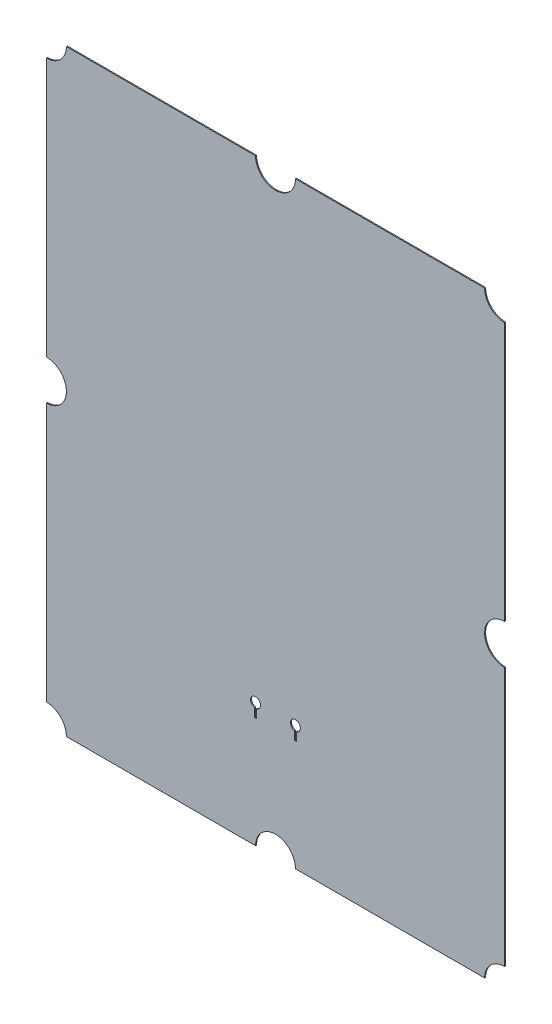
ISO-10303-21;
HEADER;
FILE_DESCRIPTION(('STEP AP214'),'2;1');
FILE_NAME('part.step','',(''),(''),'','','');
FILE_SCHEMA(('AUTOMOTIVE_DESIGN { 1 0 10303 214 1 1 1 1 }'));
ENDSEC;
DATA;
#1=APPLICATION_CONTEXT('core data for automotive mechanical design processes');
#2=APPLICATION_PROTOCOL_DEFINITION('international standard','automotive_design',2000,#1);
#3=PRODUCT_CONTEXT('',#1,'mechanical');
#4=PRODUCT('Part','Part','',(#3));
#5=PRODUCT_RELATED_PRODUCT_CATEGORY('part','',(#4));
#6=PRODUCT_DEFINITION_FORMATION('','',#4);
#7=PRODUCT_DEFINITION_CONTEXT('part definition',#1,'design');
#8=PRODUCT_DEFINITION('design','',#6,#7);
#9=PRODUCT_DEFINITION_SHAPE('','',#8);
#10=(LENGTH_UNIT() NAMED_UNIT(*) SI_UNIT(.MILLI.,.METRE.));
#11=(NAMED_UNIT(*) PLANE_ANGLE_UNIT() SI_UNIT($,.RADIAN.));
#12=(NAMED_UNIT(*) SI_UNIT($,.STERADIAN.) SOLID_ANGLE_UNIT());
#13=UNCERTAINTY_MEASURE_WITH_UNIT(LENGTH_MEASURE(1.E-05),#10,'distance_accuracy_value','');
#14=(GEOMETRIC_REPRESENTATION_CONTEXT(3) GLOBAL_UNCERTAINTY_ASSIGNED_CONTEXT((#13)) GLOBAL_UNIT_ASSIGNED_CONTEXT((#10,
#11,#12)) REPRESENTATION_CONTEXT('',''));
#15=CARTESIAN_POINT('',(0.,0.,0.));
#16=DIRECTION('',(0.,0.,1.));
#17=DIRECTION('',(1.,0.,0.));
#18=AXIS2_PLACEMENT_3D('',#15,#16,#17);
#19=CARTESIAN_POINT('',(-115.,150.,0.5));
#20=DIRECTION('',(0.,0.,-1.));
#21=DIRECTION('',(-1.,0.,0.));
#22=AXIS2_PLACEMENT_3D('',#19,#20,#21);
#23=CYLINDRICAL_SURFACE('',#22,9.99999999999999);
#24=CARTESIAN_POINT('',(-115.,150.,0.));
#25=DIRECTION('',(0.,0.,1.));
#26=DIRECTION('',(1.,0.,0.));
#27=AXIS2_PLACEMENT_3D('',#24,#25,#26);
#28=CIRCLE('',#27,9.99999999999999);
#29=CARTESIAN_POINT('',(-115.,140.,0.));
#30=VERTEX_POINT('',#29);
#31=CARTESIAN_POINT('',(-105.,150.,0.));
#32=VERTEX_POINT('',#31);
#33=EDGE_CURVE('E255',#30,#32,#28,.T.);
#34=ORIENTED_EDGE('',*,*,#33,.F.);
#35=DIRECTION('',(0.,0.,-1.));
#36=VECTOR('',#35,1.);
#37=CARTESIAN_POINT('',(-115.,140.,0.5));
#38=LINE('',#37,#36);
#39=CARTESIAN_POINT('',(-115.,140.,0.5));
#40=VERTEX_POINT('',#39);
#41=EDGE_CURVE('E11',#40,#30,#38,.T.);
#42=ORIENTED_EDGE('',*,*,#41,.F.);
#43=CARTESIAN_POINT('',(-115.,150.,0.5));
#44=DIRECTION('',(0.,0.,1.));
#45=DIRECTION('',(1.,0.,0.));
#46=AXIS2_PLACEMENT_3D('',#43,#44,#45);
#47=CIRCLE('',#46,9.99999999999999);
#48=CARTESIAN_POINT('',(-105.,150.,0.5));
#49=VERTEX_POINT('',#48);
#50=EDGE_CURVE('E262',#40,#49,#47,.T.);
#51=ORIENTED_EDGE('',*,*,#50,.T.);
#52=DIRECTION('',(0.,0.,-1.));
#53=VECTOR('',#52,1.);
#54=CARTESIAN_POINT('',(-105.,150.,0.5));
#55=LINE('',#54,#53);
#56=EDGE_CURVE('E35',#49,#32,#55,.T.);
#57=ORIENTED_EDGE('',*,*,#56,.T.);
#58=EDGE_LOOP('',(#34,#42,#51,#57));
#59=FACE_BOUND('',#58,.T.);
#60=ADVANCED_FACE('F32',(#59),#23,.F.);
#61=CARTESIAN_POINT('',(-115.,10.,0.5));
#62=DIRECTION('',(-1.,0.,0.));
#63=DIRECTION('',(0.,0.,1.));
#64=AXIS2_PLACEMENT_3D('',#61,#62,#63);
#65=PLANE('',#64);
#66=DIRECTION('',(0.,1.,0.));
#67=VECTOR('',#66,1.);
#68=CARTESIAN_POINT('',(-115.,10.,0.));
#69=LINE('',#68,#67);
#70=CARTESIAN_POINT('',(-115.,10.,0.));
#71=VERTEX_POINT('',#70);
#72=EDGE_CURVE('E266',#71,#30,#69,.T.);
#73=ORIENTED_EDGE('',*,*,#72,.F.);
#74=DIRECTION('',(0.,0.,-1.));
#75=VECTOR('',#74,1.);
#76=CARTESIAN_POINT('',(-115.,10.,0.5));
#77=LINE('',#76,#75);
#78=CARTESIAN_POINT('',(-115.,10.,0.5));
#79=VERTEX_POINT('',#78);
#80=EDGE_CURVE('E40',#79,#71,#77,.T.);
#81=ORIENTED_EDGE('',*,*,#80,.F.);
#82=DIRECTION('',(0.,1.,0.));
#83=VECTOR('',#82,1.);
#84=CARTESIAN_POINT('',(-115.,10.,0.5));
#85=LINE('',#84,#83);
#86=EDGE_CURVE('E308',#79,#40,#85,.T.);
#87=ORIENTED_EDGE('',*,*,#86,.T.);
#88=ORIENTED_EDGE('',*,*,#41,.T.);
#89=EDGE_LOOP('',(#73,#81,#87,#88));
#90=FACE_BOUND('',#89,.T.);
#91=ADVANCED_FACE('F395',(#90),#65,.T.);
#92=CARTESIAN_POINT('',(-115.,0.,0.5));
#93=DIRECTION('',(0.,0.,-1.));
#94=DIRECTION('',(-1.,0.,0.));
#95=AXIS2_PLACEMENT_3D('',#92,#93,#94);
#96=CYLINDRICAL_SURFACE('',#95,10.);
#97=CARTESIAN_POINT('',(-115.,0.,0.));
#98=DIRECTION('',(0.,0.,1.));
#99=DIRECTION('',(1.,0.,0.));
#100=AXIS2_PLACEMENT_3D('',#97,#98,#99);
#101=CIRCLE('',#100,10.);
#102=CARTESIAN_POINT('',(-115.,-9.99999999999998,0.));
#103=VERTEX_POINT('',#102);
#104=EDGE_CURVE('E352',#103,#71,#101,.T.);
#105=ORIENTED_EDGE('',*,*,#104,.F.);
#106=DIRECTION('',(0.,0.,-1.));
#107=VECTOR('',#106,1.);
#108=CARTESIAN_POINT('',(-115.,-9.99999999999998,0.5));
#109=LINE('',#108,#107);
#110=CARTESIAN_POINT('',(-115.,-9.99999999999998,0.5));
#111=VERTEX_POINT('',#110);
#112=EDGE_CURVE('E358',#111,#103,#109,.T.);
#113=ORIENTED_EDGE('',*,*,#112,.F.);
#114=CARTESIAN_POINT('',(-115.,0.,0.5));
#115=DIRECTION('',(0.,0.,1.));
#116=DIRECTION('',(1.,0.,0.));
#117=AXIS2_PLACEMENT_3D('',#114,#115,#116);
#118=CIRCLE('',#117,10.);
#119=EDGE_CURVE('E305',#111,#79,#118,.T.);
#120=ORIENTED_EDGE('',*,*,#119,.T.);
#121=ORIENTED_EDGE('',*,*,#80,.T.);
#122=EDGE_LOOP('',(#105,#113,#120,#121));
#123=FACE_BOUND('',#122,.T.);
#124=ADVANCED_FACE('F447',(#123),#96,.F.);
#125=CARTESIAN_POINT('',(-115.,-140.,0.5));
#126=DIRECTION('',(-1.,0.,0.));
#127=DIRECTION('',(0.,0.,1.));
#128=AXIS2_PLACEMENT_3D('',#125,#126,#127);
#129=PLANE('',#128);
#130=DIRECTION('',(0.,1.,0.));
#131=VECTOR('',#130,1.);
#132=CARTESIAN_POINT('',(-115.,-140.,0.));
#133=LINE('',#132,#131);
#134=CARTESIAN_POINT('',(-115.,-140.,0.));
#135=VERTEX_POINT('',#134);
#136=EDGE_CURVE('E349',#135,#103,#133,.T.);
#137=ORIENTED_EDGE('',*,*,#136,.F.);
#138=DIRECTION('',(0.,0.,-1.));
#139=VECTOR('',#138,1.);
#140=CARTESIAN_POINT('',(-115.,-140.,0.5));
#141=LINE('',#140,#139);
#142=CARTESIAN_POINT('',(-115.,-140.,0.5));
#143=VERTEX_POINT('',#142);
#144=EDGE_CURVE('E360',#143,#135,#141,.T.);
#145=ORIENTED_EDGE('',*,*,#144,.F.);
#146=DIRECTION('',(0.,1.,0.));
#147=VECTOR('',#146,1.);
#148=CARTESIAN_POINT('',(-115.,-140.,0.5));
#149=LINE('',#148,#147);
#150=EDGE_CURVE('E302',#143,#111,#149,.T.);
#151=ORIENTED_EDGE('',*,*,#150,.T.);
#152=ORIENTED_EDGE('',*,*,#112,.T.);
#153=EDGE_LOOP('',(#137,#145,#151,#152));
#154=FACE_BOUND('',#153,.T.);
#155=ADVANCED_FACE('F445',(#154),#129,.T.);
#156=CARTESIAN_POINT('',(-115.,-150.,0.5));
#157=DIRECTION('',(0.,0.,-1.));
#158=DIRECTION('',(-1.,0.,0.));
#159=AXIS2_PLACEMENT_3D('',#156,#157,#158);
#160=CYLINDRICAL_SURFACE('',#159,10.);
#161=CARTESIAN_POINT('',(-115.,-150.,0.));
#162=DIRECTION('',(0.,0.,1.));
#163=DIRECTION('',(1.,0.,0.));
#164=AXIS2_PLACEMENT_3D('',#161,#162,#163);
#165=CIRCLE('',#164,10.);
#166=CARTESIAN_POINT('',(-105.,-150.,0.));
#167=VERTEX_POINT('',#166);
#168=EDGE_CURVE('E346',#167,#135,#165,.T.);
#169=ORIENTED_EDGE('',*,*,#168,.F.);
#170=DIRECTION('',(0.,0.,-1.));
#171=VECTOR('',#170,1.);
#172=CARTESIAN_POINT('',(-105.,-150.,0.5));
#173=LINE('',#172,#171);
#174=CARTESIAN_POINT('',(-105.,-150.,0.5));
#175=VERTEX_POINT('',#174);
#176=EDGE_CURVE('E362',#175,#167,#173,.T.);
#177=ORIENTED_EDGE('',*,*,#176,.F.);
#178=CARTESIAN_POINT('',(-115.,-150.,0.5));
#179=DIRECTION('',(0.,0.,1.));
#180=DIRECTION('',(1.,0.,0.));
#181=AXIS2_PLACEMENT_3D('',#178,#179,#180);
#182=CIRCLE('',#181,10.);
#183=EDGE_CURVE('E299',#175,#143,#182,.T.);
#184=ORIENTED_EDGE('',*,*,#183,.T.);
#185=ORIENTED_EDGE('',*,*,#144,.T.);
#186=EDGE_LOOP('',(#169,#177,#184,#185));
#187=FACE_BOUND('',#186,.T.);
#188=ADVANCED_FACE('F441',(#187),#160,.F.);
#189=CARTESIAN_POINT('',(-9.99999999999993,-150.,0.5));
#190=DIRECTION('',(0.,-1.,0.));
#191=DIRECTION('',(0.,0.,-1.));
#192=AXIS2_PLACEMENT_3D('',#189,#190,#191);
#193=PLANE('',#192);
#194=DIRECTION('',(-1.,0.,0.));
#195=VECTOR('',#194,1.);
#196=CARTESIAN_POINT('',(-9.99999999999993,-150.,0.));
#197=LINE('',#196,#195);
#198=CARTESIAN_POINT('',(-9.99999999999993,-150.,0.));
#199=VERTEX_POINT('',#198);
#200=EDGE_CURVE('E343',#199,#167,#197,.T.);
#201=ORIENTED_EDGE('',*,*,#200,.F.);
#202=DIRECTION('',(0.,0.,-1.));
#203=VECTOR('',#202,1.);
#204=CARTESIAN_POINT('',(-9.99999999999993,-150.,0.5));
#205=LINE('',#204,#203);
#206=CARTESIAN_POINT('',(-9.99999999999993,-150.,0.5));
#207=VERTEX_POINT('',#206);
#208=EDGE_CURVE('E364',#207,#199,#205,.T.);
#209=ORIENTED_EDGE('',*,*,#208,.F.);
#210=DIRECTION('',(-1.,0.,0.));
#211=VECTOR('',#210,1.);
#212=CARTESIAN_POINT('',(-9.99999999999993,-150.,0.5));
#213=LINE('',#212,#211);
#214=EDGE_CURVE('E296',#207,#175,#213,.T.);
#215=ORIENTED_EDGE('',*,*,#214,.T.);
#216=ORIENTED_EDGE('',*,*,#176,.T.);
#217=EDGE_LOOP('',(#201,#209,#215,#216));
#218=FACE_BOUND('',#217,.T.);
#219=ADVANCED_FACE('F437',(#218),#193,.T.);
#220=CARTESIAN_POINT('',(0.,-150.,0.5));
#221=DIRECTION('',(0.,0.,-1.));
#222=DIRECTION('',(-1.,0.,0.));
#223=AXIS2_PLACEMENT_3D('',#220,#221,#222);
#224=CYLINDRICAL_SURFACE('',#223,9.99999999999996);
#225=CARTESIAN_POINT('',(0.,-150.,0.));
#226=DIRECTION('',(0.,0.,1.));
#227=DIRECTION('',(1.,0.,0.));
#228=AXIS2_PLACEMENT_3D('',#225,#226,#227);
#229=CIRCLE('',#228,9.99999999999996);
#230=CARTESIAN_POINT('',(10.,-150.,0.));
#231=VERTEX_POINT('',#230);
#232=EDGE_CURVE('E340',#231,#199,#229,.T.);
#233=ORIENTED_EDGE('',*,*,#232,.F.);
#234=DIRECTION('',(0.,0.,-1.));
#235=VECTOR('',#234,1.);
#236=CARTESIAN_POINT('',(10.,-150.,0.5));
#237=LINE('',#236,#235);
#238=CARTESIAN_POINT('',(10.,-150.,0.5));
#239=VERTEX_POINT('',#238);
#240=EDGE_CURVE('E366',#239,#231,#237,.T.);
#241=ORIENTED_EDGE('',*,*,#240,.F.);
#242=CARTESIAN_POINT('',(0.,-150.,0.5));
#243=DIRECTION('',(0.,0.,1.));
#244=DIRECTION('',(1.,0.,0.));
#245=AXIS2_PLACEMENT_3D('',#242,#243,#244);
#246=CIRCLE('',#245,9.99999999999996);
#247=EDGE_CURVE('E293',#239,#207,#246,.T.);
#248=ORIENTED_EDGE('',*,*,#247,.T.);
#249=ORIENTED_EDGE('',*,*,#208,.T.);
#250=EDGE_LOOP('',(#233,#241,#248,#249));
#251=FACE_BOUND('',#250,.T.);
#252=ADVANCED_FACE('F433',(#251),#224,.F.);
#253=CARTESIAN_POINT('',(105.,-150.,0.5));
#254=DIRECTION('',(0.,-1.,0.));
#255=DIRECTION('',(0.,0.,-1.));
#256=AXIS2_PLACEMENT_3D('',#253,#254,#255);
#257=PLANE('',#256);
#258=DIRECTION('',(-1.,0.,0.));
#259=VECTOR('',#258,1.);
#260=CARTESIAN_POINT('',(105.,-150.,0.));
#261=LINE('',#260,#259);
#262=CARTESIAN_POINT('',(105.,-150.,0.));
#263=VERTEX_POINT('',#262);
#264=EDGE_CURVE('E337',#263,#231,#261,.T.);
#265=ORIENTED_EDGE('',*,*,#264,.F.);
#266=DIRECTION('',(0.,0.,-1.));
#267=VECTOR('',#266,1.);
#268=CARTESIAN_POINT('',(105.,-150.,0.5));
#269=LINE('',#268,#267);
#270=CARTESIAN_POINT('',(105.,-150.,0.5));
#271=VERTEX_POINT('',#270);
#272=EDGE_CURVE('E368',#271,#263,#269,.T.);
#273=ORIENTED_EDGE('',*,*,#272,.F.);
#274=DIRECTION('',(-1.,0.,0.));
#275=VECTOR('',#274,1.);
#276=CARTESIAN_POINT('',(105.,-150.,0.5));
#277=LINE('',#276,#275);
#278=EDGE_CURVE('E290',#271,#239,#277,.T.);
#279=ORIENTED_EDGE('',*,*,#278,.T.);
#280=ORIENTED_EDGE('',*,*,#240,.T.);
#281=EDGE_LOOP('',(#265,#273,#279,#280));
#282=FACE_BOUND('',#281,.T.);
#283=ADVANCED_FACE('F429',(#282),#257,.T.);
#284=CARTESIAN_POINT('',(115.,-150.,0.5));
#285=DIRECTION('',(0.,0.,-1.));
#286=DIRECTION('',(-1.,0.,0.));
#287=AXIS2_PLACEMENT_3D('',#284,#285,#286);
#288=CYLINDRICAL_SURFACE('',#287,9.99999999999999);
#289=CARTESIAN_POINT('',(115.,-150.,0.));
#290=DIRECTION('',(0.,0.,1.));
#291=DIRECTION('',(1.,0.,0.));
#292=AXIS2_PLACEMENT_3D('',#289,#290,#291);
#293=CIRCLE('',#292,9.99999999999999);
#294=CARTESIAN_POINT('',(115.,-140.,0.));
#295=VERTEX_POINT('',#294);
#296=EDGE_CURVE('E334',#295,#263,#293,.T.);
#297=ORIENTED_EDGE('',*,*,#296,.F.);
#298=DIRECTION('',(0.,0.,-1.));
#299=VECTOR('',#298,1.);
#300=CARTESIAN_POINT('',(115.,-140.,0.5));
#301=LINE('',#300,#299);
#302=CARTESIAN_POINT('',(115.,-140.,0.5));
#303=VERTEX_POINT('',#302);
#304=EDGE_CURVE('E370',#303,#295,#301,.T.);
#305=ORIENTED_EDGE('',*,*,#304,.F.);
#306=CARTESIAN_POINT('',(115.,-150.,0.5));
#307=DIRECTION('',(0.,0.,1.));
#308=DIRECTION('',(1.,0.,0.));
#309=AXIS2_PLACEMENT_3D('',#306,#307,#308);
#310=CIRCLE('',#309,9.99999999999999);
#311=EDGE_CURVE('E287',#303,#271,#310,.T.);
#312=ORIENTED_EDGE('',*,*,#311,.T.);
#313=ORIENTED_EDGE('',*,*,#272,.T.);
#314=EDGE_LOOP('',(#297,#305,#312,#313));
#315=FACE_BOUND('',#314,.T.);
#316=ADVANCED_FACE('F425',(#315),#288,.F.);
#317=CARTESIAN_POINT('',(115.,-9.99999999999996,0.5));
#318=DIRECTION('',(1.,0.,0.));
#319=DIRECTION('',(0.,0.,-1.));
#320=AXIS2_PLACEMENT_3D('',#317,#318,#319);
#321=PLANE('',#320);
#322=DIRECTION('',(0.,-1.,0.));
#323=VECTOR('',#322,1.);
#324=CARTESIAN_POINT('',(115.,-9.99999999999996,0.));
#325=LINE('',#324,#323);
#326=CARTESIAN_POINT('',(115.,-9.99999999999996,0.));
#327=VERTEX_POINT('',#326);
#328=EDGE_CURVE('E331',#327,#295,#325,.T.);
#329=ORIENTED_EDGE('',*,*,#328,.F.);
#330=DIRECTION('',(0.,0.,-1.));
#331=VECTOR('',#330,1.);
#332=CARTESIAN_POINT('',(115.,-9.99999999999996,0.5));
#333=LINE('',#332,#331);
#334=CARTESIAN_POINT('',(115.,-9.99999999999996,0.5));
#335=VERTEX_POINT('',#334);
#336=EDGE_CURVE('E372',#335,#327,#333,.T.);
#337=ORIENTED_EDGE('',*,*,#336,.F.);
#338=DIRECTION('',(0.,-1.,0.));
#339=VECTOR('',#338,1.);
#340=CARTESIAN_POINT('',(115.,-9.99999999999996,0.5));
#341=LINE('',#340,#339);
#342=EDGE_CURVE('E284',#335,#303,#341,.T.);
#343=ORIENTED_EDGE('',*,*,#342,.T.);
#344=ORIENTED_EDGE('',*,*,#304,.T.);
#345=EDGE_LOOP('',(#329,#337,#343,#344));
#346=FACE_BOUND('',#345,.T.);
#347=ADVANCED_FACE('F421',(#346),#321,.T.);
#348=CARTESIAN_POINT('',(115.,0.,0.5));
#349=DIRECTION('',(0.,0.,-1.));
#350=DIRECTION('',(-1.,0.,0.));
#351=AXIS2_PLACEMENT_3D('',#348,#349,#350);
#352=CYLINDRICAL_SURFACE('',#351,9.99999999999998);
#353=CARTESIAN_POINT('',(115.,0.,0.));
#354=DIRECTION('',(0.,0.,1.));
#355=DIRECTION('',(1.,0.,0.));
#356=AXIS2_PLACEMENT_3D('',#353,#354,#355);
#357=CIRCLE('',#356,9.99999999999998);
#358=CARTESIAN_POINT('',(115.,9.99999999999999,0.));
#359=VERTEX_POINT('',#358);
#360=EDGE_CURVE('E328',#359,#327,#357,.T.);
#361=ORIENTED_EDGE('',*,*,#360,.F.);
#362=DIRECTION('',(0.,0.,-1.));
#363=VECTOR('',#362,1.);
#364=CARTESIAN_POINT('',(115.,9.99999999999999,0.5));
#365=LINE('',#364,#363);
#366=CARTESIAN_POINT('',(115.,9.99999999999999,0.5));
#367=VERTEX_POINT('',#366);
#368=EDGE_CURVE('E374',#367,#359,#365,.T.);
#369=ORIENTED_EDGE('',*,*,#368,.F.);
#370=CARTESIAN_POINT('',(115.,0.,0.5));
#371=DIRECTION('',(0.,0.,1.));
#372=DIRECTION('',(1.,0.,0.));
#373=AXIS2_PLACEMENT_3D('',#370,#371,#372);
#374=CIRCLE('',#373,9.99999999999998);
#375=EDGE_CURVE('E281',#367,#335,#374,.T.);
#376=ORIENTED_EDGE('',*,*,#375,.T.);
#377=ORIENTED_EDGE('',*,*,#336,.T.);
#378=EDGE_LOOP('',(#361,#369,#376,#377));
#379=FACE_BOUND('',#378,.T.);
#380=ADVANCED_FACE('F417',(#379),#352,.F.);
#381=CARTESIAN_POINT('',(115.,140.,0.5));
#382=DIRECTION('',(1.,0.,0.));
#383=DIRECTION('',(0.,0.,-1.));
#384=AXIS2_PLACEMENT_3D('',#381,#382,#383);
#385=PLANE('',#384);
#386=DIRECTION('',(0.,-1.,0.));
#387=VECTOR('',#386,1.);
#388=CARTESIAN_POINT('',(115.,140.,0.));
#389=LINE('',#388,#387);
#390=CARTESIAN_POINT('',(115.,140.,0.));
#391=VERTEX_POINT('',#390);
#392=EDGE_CURVE('E325',#391,#359,#389,.T.);
#393=ORIENTED_EDGE('',*,*,#392,.F.);
#394=DIRECTION('',(0.,0.,-1.));
#395=VECTOR('',#394,1.);
#396=CARTESIAN_POINT('',(115.,140.,0.5));
#397=LINE('',#396,#395);
#398=CARTESIAN_POINT('',(115.,140.,0.5));
#399=VERTEX_POINT('',#398);
#400=EDGE_CURVE('E376',#399,#391,#397,.T.);
#401=ORIENTED_EDGE('',*,*,#400,.F.);
#402=DIRECTION('',(0.,-1.,0.));
#403=VECTOR('',#402,1.);
#404=CARTESIAN_POINT('',(115.,140.,0.5));
#405=LINE('',#404,#403);
#406=EDGE_CURVE('E278',#399,#367,#405,.T.);
#407=ORIENTED_EDGE('',*,*,#406,.T.);
#408=ORIENTED_EDGE('',*,*,#368,.T.);
#409=EDGE_LOOP('',(#393,#401,#407,#408));
#410=FACE_BOUND('',#409,.T.);
#411=ADVANCED_FACE('F413',(#410),#385,.T.);
#412=CARTESIAN_POINT('',(115.,150.,0.5));
#413=DIRECTION('',(0.,0.,-1.));
#414=DIRECTION('',(-1.,0.,0.));
#415=AXIS2_PLACEMENT_3D('',#412,#413,#414);
#416=CYLINDRICAL_SURFACE('',#415,10.);
#417=CARTESIAN_POINT('',(115.,150.,0.));
#418=DIRECTION('',(0.,0.,1.));
#419=DIRECTION('',(1.,0.,0.));
#420=AXIS2_PLACEMENT_3D('',#417,#418,#419);
#421=CIRCLE('',#420,10.);
#422=CARTESIAN_POINT('',(105.,150.,0.));
#423=VERTEX_POINT('',#422);
#424=EDGE_CURVE('E322',#423,#391,#421,.T.);
#425=ORIENTED_EDGE('',*,*,#424,.F.);
#426=DIRECTION('',(0.,0.,-1.));
#427=VECTOR('',#426,1.);
#428=CARTESIAN_POINT('',(105.,150.,0.5));
#429=LINE('',#428,#427);
#430=CARTESIAN_POINT('',(105.,150.,0.5));
#431=VERTEX_POINT('',#430);
#432=EDGE_CURVE('E378',#431,#423,#429,.T.);
#433=ORIENTED_EDGE('',*,*,#432,.F.);
#434=CARTESIAN_POINT('',(115.,150.,0.5));
#435=DIRECTION('',(0.,0.,1.));
#436=DIRECTION('',(1.,0.,0.));
#437=AXIS2_PLACEMENT_3D('',#434,#435,#436);
#438=CIRCLE('',#437,10.);
#439=EDGE_CURVE('E275',#431,#399,#438,.T.);
#440=ORIENTED_EDGE('',*,*,#439,.T.);
#441=ORIENTED_EDGE('',*,*,#400,.T.);
#442=EDGE_LOOP('',(#425,#433,#440,#441));
#443=FACE_BOUND('',#442,.T.);
#444=ADVANCED_FACE('F409',(#443),#416,.F.);
#445=CARTESIAN_POINT('',(10.,150.,0.5));
#446=DIRECTION('',(0.,1.,0.));
#447=DIRECTION('',(0.,0.,1.));
#448=AXIS2_PLACEMENT_3D('',#445,#446,#447);
#449=PLANE('',#448);
#450=DIRECTION('',(1.,0.,0.));
#451=VECTOR('',#450,1.);
#452=CARTESIAN_POINT('',(10.,150.,0.));
#453=LINE('',#452,#451);
#454=CARTESIAN_POINT('',(10.,150.,0.));
#455=VERTEX_POINT('',#454);
#456=EDGE_CURVE('E319',#455,#423,#453,.T.);
#457=ORIENTED_EDGE('',*,*,#456,.F.);
#458=DIRECTION('',(0.,0.,-1.));
#459=VECTOR('',#458,1.);
#460=CARTESIAN_POINT('',(10.,150.,0.5));
#461=LINE('',#460,#459);
#462=CARTESIAN_POINT('',(10.,150.,0.5));
#463=VERTEX_POINT('',#462);
#464=EDGE_CURVE('E380',#463,#455,#461,.T.);
#465=ORIENTED_EDGE('',*,*,#464,.F.);
#466=DIRECTION('',(1.,0.,0.));
#467=VECTOR('',#466,1.);
#468=CARTESIAN_POINT('',(10.,150.,0.5));
#469=LINE('',#468,#467);
#470=EDGE_CURVE('E272',#463,#431,#469,.T.);
#471=ORIENTED_EDGE('',*,*,#470,.T.);
#472=ORIENTED_EDGE('',*,*,#432,.T.);
#473=EDGE_LOOP('',(#457,#465,#471,#472));
#474=FACE_BOUND('',#473,.T.);
#475=ADVANCED_FACE('F407',(#474),#449,.T.);
#476=CARTESIAN_POINT('',(0.,150.,0.5));
#477=DIRECTION('',(0.,0.,-1.));
#478=DIRECTION('',(-1.,0.,0.));
#479=AXIS2_PLACEMENT_3D('',#476,#477,#478);
#480=CYLINDRICAL_SURFACE('',#479,10.);
#481=CARTESIAN_POINT('',(0.,150.,0.));
#482=DIRECTION('',(0.,0.,1.));
#483=DIRECTION('',(1.,0.,0.));
#484=AXIS2_PLACEMENT_3D('',#481,#482,#483);
#485=CIRCLE('',#484,10.);
#486=CARTESIAN_POINT('',(-10.,150.,0.));
#487=VERTEX_POINT('',#486);
#488=EDGE_CURVE('E316',#487,#455,#485,.T.);
#489=ORIENTED_EDGE('',*,*,#488,.F.);
#490=DIRECTION('',(0.,0.,-1.));
#491=VECTOR('',#490,1.);
#492=CARTESIAN_POINT('',(-10.,150.,0.5));
#493=LINE('',#492,#491);
#494=CARTESIAN_POINT('',(-10.,150.,0.5));
#495=VERTEX_POINT('',#494);
#496=EDGE_CURVE('E381',#495,#487,#493,.T.);
#497=ORIENTED_EDGE('',*,*,#496,.F.);
#498=CARTESIAN_POINT('',(0.,150.,0.5));
#499=DIRECTION('',(0.,0.,1.));
#500=DIRECTION('',(1.,0.,0.));
#501=AXIS2_PLACEMENT_3D('',#498,#499,#500);
#502=CIRCLE('',#501,10.);
#503=EDGE_CURVE('E269',#495,#463,#502,.T.);
#504=ORIENTED_EDGE('',*,*,#503,.T.);
#505=ORIENTED_EDGE('',*,*,#464,.T.);
#506=EDGE_LOOP('',(#489,#497,#504,#505));
#507=FACE_BOUND('',#506,.T.);
#508=ADVANCED_FACE('F403',(#507),#480,.F.);
#509=CARTESIAN_POINT('',(-105.,150.,0.5));
#510=DIRECTION('',(0.,1.,0.));
#511=DIRECTION('',(0.,0.,1.));
#512=AXIS2_PLACEMENT_3D('',#509,#510,#511);
#513=PLANE('',#512);
#514=DIRECTION('',(1.,0.,0.));
#515=VECTOR('',#514,1.);
#516=CARTESIAN_POINT('',(-105.,150.,0.));
#517=LINE('',#516,#515);
#518=EDGE_CURVE('E313',#32,#487,#517,.T.);
#519=ORIENTED_EDGE('',*,*,#518,.F.);
#520=ORIENTED_EDGE('',*,*,#56,.F.);
#521=DIRECTION('',(1.,0.,0.));
#522=VECTOR('',#521,1.);
#523=CARTESIAN_POINT('',(-105.,150.,0.5));
#524=LINE('',#523,#522);
#525=EDGE_CURVE('E265',#49,#495,#524,.T.);
#526=ORIENTED_EDGE('',*,*,#525,.T.);
#527=ORIENTED_EDGE('',*,*,#496,.T.);
#528=EDGE_LOOP('',(#519,#520,#526,#527));
#529=FACE_BOUND('',#528,.T.);
#530=ADVANCED_FACE('F389',(#529),#513,.T.);
#531=CARTESIAN_POINT('',(-115.,150.,0.5));
#532=DIRECTION('',(0.,0.,1.));
#533=DIRECTION('',(1.,0.,0.));
#534=AXIS2_PLACEMENT_3D('',#531,#532,#533);
#535=PLANE('',#534);
#536=DIRECTION('',(-1.,0.,0.));
#537=VECTOR('',#536,1.);
#538=CARTESIAN_POINT('',(9.49999999999998,-94.4483852386475,0.5));
#539=LINE('',#538,#537);
#540=CARTESIAN_POINT('',(10.5,-94.4483852386475,0.5));
#541=VERTEX_POINT('',#540);
#542=CARTESIAN_POINT('',(9.49999999999998,-94.4483852386475,0.5));
#543=VERTEX_POINT('',#542);
#544=EDGE_CURVE('E195',#541,#543,#539,.T.);
#545=ORIENTED_EDGE('',*,*,#544,.T.);
#546=DIRECTION('',(0.,1.,0.));
#547=VECTOR('',#546,1.);
#548=CARTESIAN_POINT('',(9.49999999999998,-90.1417981686865,0.5));
#549=LINE('',#548,#547);
#550=CARTESIAN_POINT('',(9.49999999999998,-90.1417981686865,0.5));
#551=VERTEX_POINT('',#550);
#552=EDGE_CURVE('E204',#543,#551,#549,.T.);
#553=ORIENTED_EDGE('',*,*,#552,.T.);
#554=CARTESIAN_POINT('',(9.99999999999998,-87.6923084259033,0.5));
#555=DIRECTION('',(0.,0.,-1.));
#556=DIRECTION('',(1.,0.,0.));
#557=AXIS2_PLACEMENT_3D('',#554,#555,#556);
#558=CIRCLE('',#557,2.5);
#559=CARTESIAN_POINT('',(10.5,-90.1417981686865,0.5));
#560=VERTEX_POINT('',#559);
#561=EDGE_CURVE('E48',#551,#560,#558,.T.);
#562=ORIENTED_EDGE('',*,*,#561,.T.);
#563=DIRECTION('',(0.,-1.,0.));
#564=VECTOR('',#563,1.);
#565=CARTESIAN_POINT('',(10.5,-94.4483852386475,0.5));
#566=LINE('',#565,#564);
#567=EDGE_CURVE('E201',#560,#541,#566,.T.);
#568=ORIENTED_EDGE('',*,*,#567,.T.);
#569=EDGE_LOOP('',(#545,#553,#562,#568));
#570=FACE_BOUND('',#569,.T.);
#571=DIRECTION('',(-1.,0.,0.));
#572=VECTOR('',#571,1.);
#573=CARTESIAN_POINT('',(-10.5,-94.4483852386475,0.5));
#574=LINE('',#573,#572);
#575=CARTESIAN_POINT('',(-9.5,-94.4483852386475,0.5));
#576=VERTEX_POINT('',#575);
#577=CARTESIAN_POINT('',(-10.5,-94.4483852386475,0.5));
#578=VERTEX_POINT('',#577);
#579=EDGE_CURVE('E230',#576,#578,#574,.T.);
#580=ORIENTED_EDGE('',*,*,#579,.T.);
#581=DIRECTION('',(0.,1.,0.));
#582=VECTOR('',#581,1.);
#583=CARTESIAN_POINT('',(-10.5,-90.1417981686865,0.5));
#584=LINE('',#583,#582);
#585=CARTESIAN_POINT('',(-10.5,-90.1417981686865,0.5));
#586=VERTEX_POINT('',#585);
#587=EDGE_CURVE('E233',#578,#586,#584,.T.);
#588=ORIENTED_EDGE('',*,*,#587,.T.);
#589=CARTESIAN_POINT('',(-10.,-87.6923084259033,0.5));
#590=DIRECTION('',(0.,0.,-1.));
#591=DIRECTION('',(1.,0.,0.));
#592=AXIS2_PLACEMENT_3D('',#589,#590,#591);
#593=CIRCLE('',#592,2.5);
#594=CARTESIAN_POINT('',(-9.5,-90.1417981686865,0.5));
#595=VERTEX_POINT('',#594);
#596=EDGE_CURVE('E237',#586,#595,#593,.T.);
#597=ORIENTED_EDGE('',*,*,#596,.T.);
#598=DIRECTION('',(0.,-1.,0.));
#599=VECTOR('',#598,1.);
#600=CARTESIAN_POINT('',(-9.5,-94.4483852386475,0.5));
#601=LINE('',#600,#599);
#602=EDGE_CURVE('E240',#595,#576,#601,.T.);
#603=ORIENTED_EDGE('',*,*,#602,.T.);
#604=EDGE_LOOP('',(#580,#588,#597,#603));
#605=FACE_BOUND('',#604,.T.);
#606=ORIENTED_EDGE('',*,*,#50,.F.);
#607=ORIENTED_EDGE('',*,*,#86,.F.);
#608=ORIENTED_EDGE('',*,*,#119,.F.);
#609=ORIENTED_EDGE('',*,*,#150,.F.);
#610=ORIENTED_EDGE('',*,*,#183,.F.);
#611=ORIENTED_EDGE('',*,*,#214,.F.);
#612=ORIENTED_EDGE('',*,*,#247,.F.);
#613=ORIENTED_EDGE('',*,*,#278,.F.);
#614=ORIENTED_EDGE('',*,*,#311,.F.);
#615=ORIENTED_EDGE('',*,*,#342,.F.);
#616=ORIENTED_EDGE('',*,*,#375,.F.);
#617=ORIENTED_EDGE('',*,*,#406,.F.);
#618=ORIENTED_EDGE('',*,*,#439,.F.);
#619=ORIENTED_EDGE('',*,*,#470,.F.);
#620=ORIENTED_EDGE('',*,*,#503,.F.);
#621=ORIENTED_EDGE('',*,*,#525,.F.);
#622=EDGE_LOOP('',(#606,#607,#608,#609,#610,#611,#612,#613,#614,#615,#616,#617,#618,#619,#620,#621));
#623=FACE_BOUND('',#622,.T.);
#624=ADVANCED_FACE('F208',(#570,#605,#623),#535,.T.);
#625=CARTESIAN_POINT('',(-115.,150.,0.));
#626=DIRECTION('',(0.,0.,1.));
#627=DIRECTION('',(1.,0.,0.));
#628=AXIS2_PLACEMENT_3D('',#625,#626,#627);
#629=PLANE('',#628);
#630=DIRECTION('',(0.,1.,0.));
#631=VECTOR('',#630,1.);
#632=CARTESIAN_POINT('',(9.49999999999998,-90.1417981686865,0.));
#633=LINE('',#632,#631);
#634=CARTESIAN_POINT('',(9.49999999999998,-94.4483852386475,0.));
#635=VERTEX_POINT('',#634);
#636=CARTESIAN_POINT('',(9.49999999999998,-90.1417981686865,0.));
#637=VERTEX_POINT('',#636);
#638=EDGE_CURVE('E220',#635,#637,#633,.T.);
#639=ORIENTED_EDGE('',*,*,#638,.F.);
#640=DIRECTION('',(-1.,0.,0.));
#641=VECTOR('',#640,1.);
#642=CARTESIAN_POINT('',(9.49999999999998,-94.4483852386475,0.));
#643=LINE('',#642,#641);
#644=CARTESIAN_POINT('',(10.5,-94.4483852386475,0.));
#645=VERTEX_POINT('',#644);
#646=EDGE_CURVE('E56',#645,#635,#643,.T.);
#647=ORIENTED_EDGE('',*,*,#646,.F.);
#648=DIRECTION('',(0.,-1.,0.));
#649=VECTOR('',#648,1.);
#650=CARTESIAN_POINT('',(10.5,-94.4483852386475,0.));
#651=LINE('',#650,#649);
#652=CARTESIAN_POINT('',(10.5,-90.1417981686865,0.));
#653=VERTEX_POINT('',#652);
#654=EDGE_CURVE('E211',#653,#645,#651,.T.);
#655=ORIENTED_EDGE('',*,*,#654,.F.);
#656=CARTESIAN_POINT('',(9.99999999999998,-87.6923084259033,0.));
#657=DIRECTION('',(0.,0.,-1.));
#658=DIRECTION('',(1.,0.,0.));
#659=AXIS2_PLACEMENT_3D('',#656,#657,#658);
#660=CIRCLE('',#659,2.5);
#661=EDGE_CURVE('E214',#637,#653,#660,.T.);
#662=ORIENTED_EDGE('',*,*,#661,.F.);
#663=EDGE_LOOP('',(#639,#647,#655,#662));
#664=FACE_BOUND('',#663,.T.);
#665=DIRECTION('',(0.,1.,0.));
#666=VECTOR('',#665,1.);
#667=CARTESIAN_POINT('',(-10.5,-90.1417981686865,0.));
#668=LINE('',#667,#666);
#669=CARTESIAN_POINT('',(-10.5,-94.4483852386475,0.));
#670=VERTEX_POINT('',#669);
#671=CARTESIAN_POINT('',(-10.5,-90.1417981686865,0.));
#672=VERTEX_POINT('',#671);
#673=EDGE_CURVE('E245',#670,#672,#668,.T.);
#674=ORIENTED_EDGE('',*,*,#673,.F.);
#675=DIRECTION('',(-1.,0.,0.));
#676=VECTOR('',#675,1.);
#677=CARTESIAN_POINT('',(-10.5,-94.4483852386475,0.));
#678=LINE('',#677,#676);
#679=CARTESIAN_POINT('',(-9.5,-94.4483852386475,0.));
#680=VERTEX_POINT('',#679);
#681=EDGE_CURVE('E226',#680,#670,#678,.T.);
#682=ORIENTED_EDGE('',*,*,#681,.F.);
#683=DIRECTION('',(0.,-1.,0.));
#684=VECTOR('',#683,1.);
#685=CARTESIAN_POINT('',(-9.5,-94.4483852386475,0.));
#686=LINE('',#685,#684);
#687=CARTESIAN_POINT('',(-9.5,-90.1417981686865,0.));
#688=VERTEX_POINT('',#687);
#689=EDGE_CURVE('E234',#688,#680,#686,.T.);
#690=ORIENTED_EDGE('',*,*,#689,.F.);
#691=CARTESIAN_POINT('',(-10.,-87.6923084259033,0.));
#692=DIRECTION('',(0.,0.,-1.));
#693=DIRECTION('',(1.,0.,0.));
#694=AXIS2_PLACEMENT_3D('',#691,#692,#693);
#695=CIRCLE('',#694,2.5);
#696=EDGE_CURVE('E248',#672,#688,#695,.T.);
#697=ORIENTED_EDGE('',*,*,#696,.F.);
#698=EDGE_LOOP('',(#674,#682,#690,#697));
#699=FACE_BOUND('',#698,.T.);
#700=ORIENTED_EDGE('',*,*,#33,.T.);
#701=ORIENTED_EDGE('',*,*,#518,.T.);
#702=ORIENTED_EDGE('',*,*,#488,.T.);
#703=ORIENTED_EDGE('',*,*,#456,.T.);
#704=ORIENTED_EDGE('',*,*,#424,.T.);
#705=ORIENTED_EDGE('',*,*,#392,.T.);
#706=ORIENTED_EDGE('',*,*,#360,.T.);
#707=ORIENTED_EDGE('',*,*,#328,.T.);
#708=ORIENTED_EDGE('',*,*,#296,.T.);
#709=ORIENTED_EDGE('',*,*,#264,.T.);
#710=ORIENTED_EDGE('',*,*,#232,.T.);
#711=ORIENTED_EDGE('',*,*,#200,.T.);
#712=ORIENTED_EDGE('',*,*,#168,.T.);
#713=ORIENTED_EDGE('',*,*,#136,.T.);
#714=ORIENTED_EDGE('',*,*,#104,.T.);
#715=ORIENTED_EDGE('',*,*,#72,.T.);
#716=EDGE_LOOP('',(#700,#701,#702,#703,#704,#705,#706,#707,#708,#709,#710,#711,#712,#713,#714,#715));
#717=FACE_BOUND('',#716,.T.);
#718=ADVANCED_FACE('F391',(#664,#699,#717),#629,.F.);
#719=CARTESIAN_POINT('',(-10.5,-94.4483852386475,0.5));
#720=DIRECTION('',(0.,-1.,0.));
#721=DIRECTION('',(0.,0.,-1.));
#722=AXIS2_PLACEMENT_3D('',#719,#720,#721);
#723=PLANE('',#722);
#724=ORIENTED_EDGE('',*,*,#681,.T.);
#725=DIRECTION('',(0.,0.,-1.));
#726=VECTOR('',#725,1.);
#727=CARTESIAN_POINT('',(-10.5,-94.4483852386475,0.5));
#728=LINE('',#727,#726);
#729=EDGE_CURVE('E243',#578,#670,#728,.T.);
#730=ORIENTED_EDGE('',*,*,#729,.F.);
#731=ORIENTED_EDGE('',*,*,#579,.F.);
#732=DIRECTION('',(0.,0.,-1.));
#733=VECTOR('',#732,1.);
#734=CARTESIAN_POINT('',(-9.5,-94.4483852386475,0.5));
#735=LINE('',#734,#733);
#736=EDGE_CURVE('E253',#576,#680,#735,.T.);
#737=ORIENTED_EDGE('',*,*,#736,.T.);
#738=EDGE_LOOP('',(#724,#730,#731,#737));
#739=FACE_BOUND('',#738,.T.);
#740=ADVANCED_FACE('F585',(#739),#723,.F.);
#741=CARTESIAN_POINT('',(-9.5,-94.4483852386475,0.5));
#742=DIRECTION('',(1.,0.,0.));
#743=DIRECTION('',(0.,0.,-1.));
#744=AXIS2_PLACEMENT_3D('',#741,#742,#743);
#745=PLANE('',#744);
#746=ORIENTED_EDGE('',*,*,#689,.T.);
#747=ORIENTED_EDGE('',*,*,#736,.F.);
#748=ORIENTED_EDGE('',*,*,#602,.F.);
#749=DIRECTION('',(0.,0.,-1.));
#750=VECTOR('',#749,1.);
#751=CARTESIAN_POINT('',(-9.5,-90.1417981686865,0.5));
#752=LINE('',#751,#750);
#753=EDGE_CURVE('E256',#595,#688,#752,.T.);
#754=ORIENTED_EDGE('',*,*,#753,.T.);
#755=EDGE_LOOP('',(#746,#747,#748,#754));
#756=FACE_BOUND('',#755,.T.);
#757=ADVANCED_FACE('F595',(#756),#745,.F.);
#758=CARTESIAN_POINT('',(-10.,-87.6923084259033,0.5));
#759=DIRECTION('',(0.,0.,-1.));
#760=DIRECTION('',(-1.,0.,0.));
#761=AXIS2_PLACEMENT_3D('',#758,#759,#760);
#762=CYLINDRICAL_SURFACE('',#761,2.5);
#763=ORIENTED_EDGE('',*,*,#696,.T.);
#764=ORIENTED_EDGE('',*,*,#753,.F.);
#765=ORIENTED_EDGE('',*,*,#596,.F.);
#766=DIRECTION('',(0.,0.,-1.));
#767=VECTOR('',#766,1.);
#768=CARTESIAN_POINT('',(-10.5,-90.1417981686865,0.5));
#769=LINE('',#768,#767);
#770=EDGE_CURVE('E258',#586,#672,#769,.T.);
#771=ORIENTED_EDGE('',*,*,#770,.T.);
#772=EDGE_LOOP('',(#763,#764,#765,#771));
#773=FACE_BOUND('',#772,.T.);
#774=ADVANCED_FACE('F605',(#773),#762,.F.);
#775=CARTESIAN_POINT('',(-10.5,-90.1417981686865,0.5));
#776=DIRECTION('',(-1.,0.,0.));
#777=DIRECTION('',(0.,0.,1.));
#778=AXIS2_PLACEMENT_3D('',#775,#776,#777);
#779=PLANE('',#778);
#780=ORIENTED_EDGE('',*,*,#673,.T.);
#781=ORIENTED_EDGE('',*,*,#770,.F.);
#782=ORIENTED_EDGE('',*,*,#587,.F.);
#783=ORIENTED_EDGE('',*,*,#729,.T.);
#784=EDGE_LOOP('',(#780,#781,#782,#783));
#785=FACE_BOUND('',#784,.T.);
#786=ADVANCED_FACE('F615',(#785),#779,.F.);
#787=CARTESIAN_POINT('',(9.49999999999998,-94.4483852386475,0.5));
#788=DIRECTION('',(0.,-1.,0.));
#789=DIRECTION('',(0.,0.,-1.));
#790=AXIS2_PLACEMENT_3D('',#787,#788,#789);
#791=PLANE('',#790);
#792=ORIENTED_EDGE('',*,*,#646,.T.);
#793=DIRECTION('',(0.,0.,-1.));
#794=VECTOR('',#793,1.);
#795=CARTESIAN_POINT('',(9.49999999999998,-94.4483852386475,0.5));
#796=LINE('',#795,#794);
#797=EDGE_CURVE('E191',#543,#635,#796,.T.);
#798=ORIENTED_EDGE('',*,*,#797,.F.);
#799=ORIENTED_EDGE('',*,*,#544,.F.);
#800=DIRECTION('',(0.,0.,-1.));
#801=VECTOR('',#800,1.);
#802=CARTESIAN_POINT('',(10.5,-94.4483852386475,0.5));
#803=LINE('',#802,#801);
#804=EDGE_CURVE('E224',#541,#645,#803,.T.);
#805=ORIENTED_EDGE('',*,*,#804,.T.);
#806=EDGE_LOOP('',(#792,#798,#799,#805));
#807=FACE_BOUND('',#806,.T.);
#808=ADVANCED_FACE('F193',(#807),#791,.F.);
#809=CARTESIAN_POINT('',(10.5,-94.4483852386475,0.5));
#810=DIRECTION('',(1.,0.,0.));
#811=DIRECTION('',(0.,0.,-1.));
#812=AXIS2_PLACEMENT_3D('',#809,#810,#811);
#813=PLANE('',#812);
#814=ORIENTED_EDGE('',*,*,#654,.T.);
#815=ORIENTED_EDGE('',*,*,#804,.F.);
#816=ORIENTED_EDGE('',*,*,#567,.F.);
#817=DIRECTION('',(0.,0.,-1.));
#818=VECTOR('',#817,1.);
#819=CARTESIAN_POINT('',(10.5,-90.1417981686865,0.5));
#820=LINE('',#819,#818);
#821=EDGE_CURVE('E227',#560,#653,#820,.T.);
#822=ORIENTED_EDGE('',*,*,#821,.T.);
#823=EDGE_LOOP('',(#814,#815,#816,#822));
#824=FACE_BOUND('',#823,.T.);
#825=ADVANCED_FACE('F634',(#824),#813,.F.);
#826=CARTESIAN_POINT('',(9.99999999999998,-87.6923084259033,0.5));
#827=DIRECTION('',(0.,0.,-1.));
#828=DIRECTION('',(-1.,0.,0.));
#829=AXIS2_PLACEMENT_3D('',#826,#827,#828);
#830=CYLINDRICAL_SURFACE('',#829,2.5);
#831=ORIENTED_EDGE('',*,*,#661,.T.);
#832=ORIENTED_EDGE('',*,*,#821,.F.);
#833=ORIENTED_EDGE('',*,*,#561,.F.);
#834=DIRECTION('',(0.,0.,-1.));
#835=VECTOR('',#834,1.);
#836=CARTESIAN_POINT('',(9.49999999999998,-90.1417981686865,0.5));
#837=LINE('',#836,#835);
#838=EDGE_CURVE('E200',#551,#637,#837,.T.);
#839=ORIENTED_EDGE('',*,*,#838,.T.);
#840=EDGE_LOOP('',(#831,#832,#833,#839));
#841=FACE_BOUND('',#840,.T.);
#842=ADVANCED_FACE('F643',(#841),#830,.F.);
#843=CARTESIAN_POINT('',(9.49999999999998,-90.1417981686865,0.5));
#844=DIRECTION('',(-1.,0.,0.));
#845=DIRECTION('',(0.,0.,1.));
#846=AXIS2_PLACEMENT_3D('',#843,#844,#845);
#847=PLANE('',#846);
#848=ORIENTED_EDGE('',*,*,#638,.T.);
#849=ORIENTED_EDGE('',*,*,#838,.F.);
#850=ORIENTED_EDGE('',*,*,#552,.F.);
#851=ORIENTED_EDGE('',*,*,#797,.T.);
#852=EDGE_LOOP('',(#848,#849,#850,#851));
#853=FACE_BOUND('',#852,.T.);
#854=ADVANCED_FACE('F205',(#853),#847,.F.);
#855=CLOSED_SHELL('',(#60,#91,#124,#155,#188,#219,#252,#283,#316,#347,#380,#411,#444,#475,#508,
#530,#624,#718,#740,#757,#774,#786,#808,#825,#842,#854));
#856=MANIFOLD_SOLID_BREP('B2',#855);
#857=ADVANCED_BREP_SHAPE_REPRESENTATION('',(#18,#856),#14);
#858=SHAPE_DEFINITION_REPRESENTATION(#9,#857);
ENDSEC;
END-ISO-10303-21;
